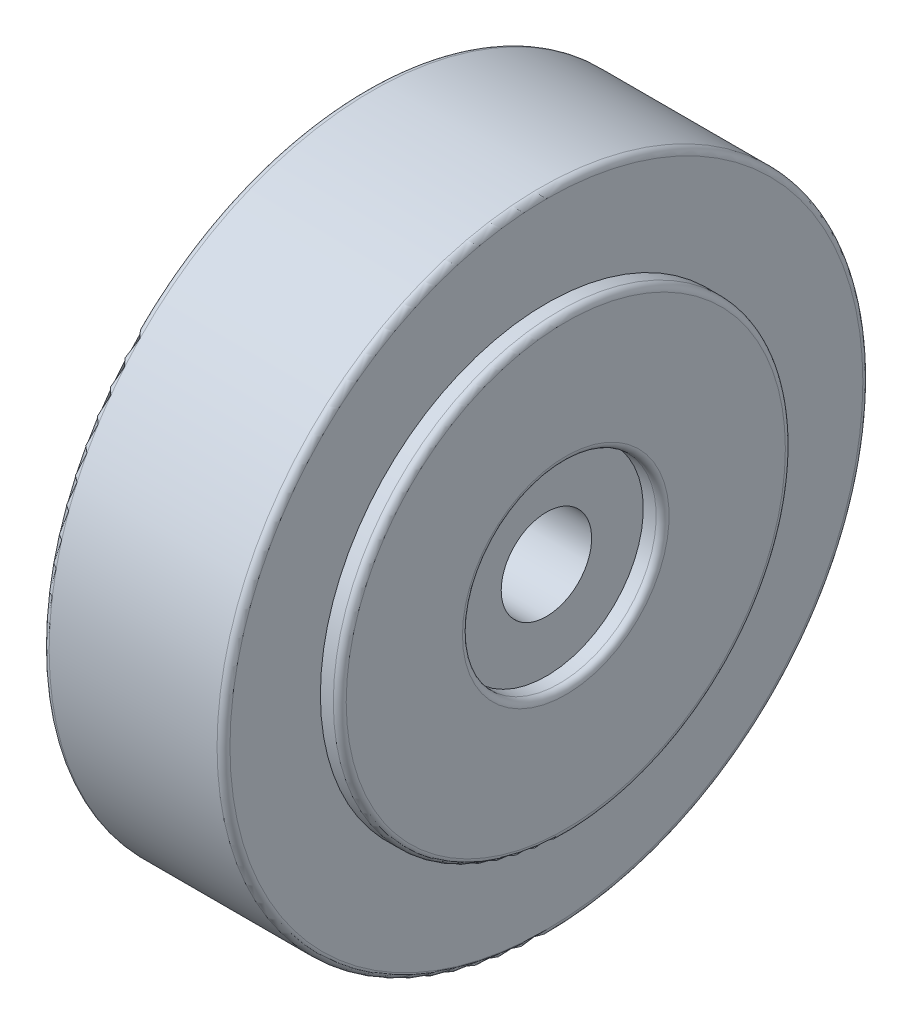
ISO-10303-21;
HEADER;
FILE_DESCRIPTION(('STEP AP214'),'2;1');
FILE_NAME('part.step','',(''),(''),'','','');
FILE_SCHEMA(('AUTOMOTIVE_DESIGN { 1 0 10303 214 1 1 1 1 }'));
ENDSEC;
DATA;
#1=APPLICATION_CONTEXT('core data for automotive mechanical design processes');
#2=APPLICATION_PROTOCOL_DEFINITION('international standard','automotive_design',2000,#1);
#3=PRODUCT_CONTEXT('',#1,'mechanical');
#4=PRODUCT('Part','Part','',(#3));
#5=PRODUCT_RELATED_PRODUCT_CATEGORY('part','',(#4));
#6=PRODUCT_DEFINITION_FORMATION('','',#4);
#7=PRODUCT_DEFINITION_CONTEXT('part definition',#1,'design');
#8=PRODUCT_DEFINITION('design','',#6,#7);
#9=PRODUCT_DEFINITION_SHAPE('','',#8);
#10=(LENGTH_UNIT() NAMED_UNIT(*) SI_UNIT(.MILLI.,.METRE.));
#11=(NAMED_UNIT(*) PLANE_ANGLE_UNIT() SI_UNIT($,.RADIAN.));
#12=(NAMED_UNIT(*) SI_UNIT($,.STERADIAN.) SOLID_ANGLE_UNIT());
#13=UNCERTAINTY_MEASURE_WITH_UNIT(LENGTH_MEASURE(1.E-05),#10,'distance_accuracy_value','');
#14=(GEOMETRIC_REPRESENTATION_CONTEXT(3) GLOBAL_UNCERTAINTY_ASSIGNED_CONTEXT((#13)) GLOBAL_UNIT_ASSIGNED_CONTEXT((#10,
#11,#12)) REPRESENTATION_CONTEXT('',''));
#15=CARTESIAN_POINT('',(0.,0.,0.));
#16=DIRECTION('',(0.,0.,1.));
#17=DIRECTION('',(1.,0.,0.));
#18=AXIS2_PLACEMENT_3D('',#15,#16,#17);
#19=CARTESIAN_POINT('',(0.,0.,0.));
#20=DIRECTION('',(-1.,0.,0.));
#21=DIRECTION('',(0.,0.,1.));
#22=AXIS2_PLACEMENT_3D('',#19,#20,#21);
#23=CYLINDRICAL_SURFACE('',#22,7.);
#24=CARTESIAN_POINT('',(14.,0.,0.));
#25=DIRECTION('',(-1.,0.,0.));
#26=DIRECTION('',(0.,0.,1.));
#27=AXIS2_PLACEMENT_3D('',#24,#25,#26);
#28=CIRCLE('',#27,7.);
#29=CARTESIAN_POINT('',(14.,0.,7.));
#30=VERTEX_POINT('',#29);
#31=EDGE_CURVE('E88',#30,#30,#28,.T.);
#32=ORIENTED_EDGE('',*,*,#31,.F.);
#33=EDGE_LOOP('',(#32));
#34=FACE_BOUND('',#33,.T.);
#35=CARTESIAN_POINT('',(-14.,0.,0.));
#36=DIRECTION('',(-1.,0.,0.));
#37=DIRECTION('',(0.,0.,1.));
#38=AXIS2_PLACEMENT_3D('',#35,#36,#37);
#39=CIRCLE('',#38,7.);
#40=CARTESIAN_POINT('',(-14.,0.,7.));
#41=VERTEX_POINT('',#40);
#42=EDGE_CURVE('E103',#41,#41,#39,.T.);
#43=ORIENTED_EDGE('',*,*,#42,.T.);
#44=EDGE_LOOP('',(#43));
#45=FACE_BOUND('',#44,.T.);
#46=ADVANCED_FACE('F44',(#34,#45),#23,.F.);
#47=CARTESIAN_POINT('',(14.,7.,0.));
#48=DIRECTION('',(-1.,0.,0.));
#49=DIRECTION('',(0.,0.,1.));
#50=AXIS2_PLACEMENT_3D('',#47,#48,#49);
#51=PLANE('',#50);
#52=CARTESIAN_POINT('',(14.,0.,0.));
#53=DIRECTION('',(-1.,0.,0.));
#54=DIRECTION('',(0.,0.,1.));
#55=AXIS2_PLACEMENT_3D('',#52,#53,#54);
#56=CIRCLE('',#55,15.);
#57=CARTESIAN_POINT('',(14.,0.,15.));
#58=VERTEX_POINT('',#57);
#59=EDGE_CURVE('E91',#58,#58,#56,.T.);
#60=ORIENTED_EDGE('',*,*,#59,.F.);
#61=EDGE_LOOP('',(#60));
#62=FACE_BOUND('',#61,.T.);
#63=ORIENTED_EDGE('',*,*,#31,.T.);
#64=EDGE_LOOP('',(#63));
#65=FACE_BOUND('',#64,.T.);
#66=ADVANCED_FACE('F128',(#62,#65),#51,.F.);
#67=CARTESIAN_POINT('',(0.,0.,0.));
#68=DIRECTION('',(-1.,0.,0.));
#69=DIRECTION('',(0.,0.,1.));
#70=AXIS2_PLACEMENT_3D('',#67,#68,#69);
#71=CYLINDRICAL_SURFACE('',#70,15.);
#72=CARTESIAN_POINT('',(16.,0.,0.));
#73=DIRECTION('',(-1.,0.,0.));
#74=DIRECTION('',(0.,0.,1.));
#75=AXIS2_PLACEMENT_3D('',#72,#73,#74);
#76=CIRCLE('',#75,15.);
#77=CARTESIAN_POINT('',(16.,0.,15.));
#78=VERTEX_POINT('',#77);
#79=EDGE_CURVE('E70',#78,#78,#76,.F.);
#80=ORIENTED_EDGE('',*,*,#79,.T.);
#81=EDGE_LOOP('',(#80));
#82=FACE_BOUND('',#81,.T.);
#83=ORIENTED_EDGE('',*,*,#59,.T.);
#84=EDGE_LOOP('',(#83));
#85=FACE_BOUND('',#84,.T.);
#86=ADVANCED_FACE('F134',(#82,#85),#71,.F.);
#87=CARTESIAN_POINT('',(17.,15.,0.));
#88=DIRECTION('',(-1.,0.,0.));
#89=DIRECTION('',(0.,0.,1.));
#90=AXIS2_PLACEMENT_3D('',#87,#88,#89);
#91=PLANE('',#90);
#92=CARTESIAN_POINT('',(17.,0.,0.));
#93=DIRECTION('',(-1.,0.,0.));
#94=DIRECTION('',(0.,0.,1.));
#95=AXIS2_PLACEMENT_3D('',#92,#93,#94);
#96=CIRCLE('',#95,16.);
#97=CARTESIAN_POINT('',(17.,0.,16.));
#98=VERTEX_POINT('',#97);
#99=EDGE_CURVE('E73',#98,#98,#96,.T.);
#100=ORIENTED_EDGE('',*,*,#99,.T.);
#101=EDGE_LOOP('',(#100));
#102=FACE_BOUND('',#101,.T.);
#103=CARTESIAN_POINT('',(17.,0.,0.));
#104=DIRECTION('',(-1.,0.,0.));
#105=DIRECTION('',(0.,0.,1.));
#106=AXIS2_PLACEMENT_3D('',#103,#104,#105);
#107=CIRCLE('',#106,34.);
#108=CARTESIAN_POINT('',(17.,0.,34.));
#109=VERTEX_POINT('',#108);
#110=EDGE_CURVE('E76',#109,#109,#107,.F.);
#111=ORIENTED_EDGE('',*,*,#110,.T.);
#112=EDGE_LOOP('',(#111));
#113=FACE_BOUND('',#112,.T.);
#114=ADVANCED_FACE('F185',(#102,#113),#91,.F.);
#115=CARTESIAN_POINT('',(0.,0.,0.));
#116=DIRECTION('',(-1.,0.,0.));
#117=DIRECTION('',(0.,0.,1.));
#118=AXIS2_PLACEMENT_3D('',#115,#116,#117);
#119=CYLINDRICAL_SURFACE('',#118,35.);
#120=CARTESIAN_POINT('',(16.,0.,0.));
#121=DIRECTION('',(-1.,0.,0.));
#122=DIRECTION('',(0.,0.,1.));
#123=AXIS2_PLACEMENT_3D('',#120,#121,#122);
#124=CIRCLE('',#123,35.);
#125=CARTESIAN_POINT('',(16.,0.,35.));
#126=VERTEX_POINT('',#125);
#127=EDGE_CURVE('E67',#126,#126,#124,.T.);
#128=ORIENTED_EDGE('',*,*,#127,.T.);
#129=EDGE_LOOP('',(#128));
#130=FACE_BOUND('',#129,.T.);
#131=CARTESIAN_POINT('',(14.,0.,0.));
#132=DIRECTION('',(-1.,0.,0.));
#133=DIRECTION('',(0.,0.,1.));
#134=AXIS2_PLACEMENT_3D('',#131,#132,#133);
#135=CIRCLE('',#134,35.);
#136=CARTESIAN_POINT('',(14.,0.,35.));
#137=VERTEX_POINT('',#136);
#138=EDGE_CURVE('E94',#137,#137,#135,.T.);
#139=ORIENTED_EDGE('',*,*,#138,.F.);
#140=EDGE_LOOP('',(#139));
#141=FACE_BOUND('',#140,.T.);
#142=ADVANCED_FACE('F182',(#130,#141),#119,.T.);
#143=CARTESIAN_POINT('',(14.,35.,0.));
#144=DIRECTION('',(-1.,0.,0.));
#145=DIRECTION('',(0.,0.,1.));
#146=AXIS2_PLACEMENT_3D('',#143,#144,#145);
#147=PLANE('',#146);
#148=CARTESIAN_POINT('',(14.,0.,0.));
#149=DIRECTION('',(-1.,0.,0.));
#150=DIRECTION('',(0.,0.,1.));
#151=AXIS2_PLACEMENT_3D('',#148,#149,#150);
#152=CIRCLE('',#151,49.);
#153=CARTESIAN_POINT('',(14.,0.,49.));
#154=VERTEX_POINT('',#153);
#155=EDGE_CURVE('E10',#154,#154,#152,.F.);
#156=ORIENTED_EDGE('',*,*,#155,.T.);
#157=EDGE_LOOP('',(#156));
#158=FACE_BOUND('',#157,.T.);
#159=ORIENTED_EDGE('',*,*,#138,.T.);
#160=EDGE_LOOP('',(#159));
#161=FACE_BOUND('',#160,.T.);
#162=ADVANCED_FACE('F179',(#158,#161),#147,.F.);
#163=CARTESIAN_POINT('',(0.,0.,0.));
#164=DIRECTION('',(-1.,0.,0.));
#165=DIRECTION('',(0.,0.,1.));
#166=AXIS2_PLACEMENT_3D('',#163,#164,#165);
#167=CYLINDRICAL_SURFACE('',#166,50.);
#168=CARTESIAN_POINT('',(-13.,0.,0.));
#169=DIRECTION('',(1.,0.,0.));
#170=DIRECTION('',(0.,0.,-1.));
#171=AXIS2_PLACEMENT_3D('',#168,#169,#170);
#172=CIRCLE('',#171,50.);
#173=CARTESIAN_POINT('',(-13.,0.,-50.));
#174=VERTEX_POINT('',#173);
#175=EDGE_CURVE('E51',#174,#174,#172,.T.);
#176=ORIENTED_EDGE('',*,*,#175,.T.);
#177=EDGE_LOOP('',(#176));
#178=FACE_BOUND('',#177,.T.);
#179=CARTESIAN_POINT('',(13.,0.,0.));
#180=DIRECTION('',(-1.,0.,0.));
#181=DIRECTION('',(0.,0.,1.));
#182=AXIS2_PLACEMENT_3D('',#179,#180,#181);
#183=CIRCLE('',#182,50.);
#184=CARTESIAN_POINT('',(13.,0.,50.));
#185=VERTEX_POINT('',#184);
#186=EDGE_CURVE('E55',#185,#185,#183,.T.);
#187=ORIENTED_EDGE('',*,*,#186,.T.);
#188=EDGE_LOOP('',(#187));
#189=FACE_BOUND('',#188,.T.);
#190=ADVANCED_FACE('F166',(#178,#189),#167,.T.);
#191=CARTESIAN_POINT('',(-14.,35.,0.));
#192=DIRECTION('',(1.,0.,0.));
#193=DIRECTION('',(0.,0.,-1.));
#194=AXIS2_PLACEMENT_3D('',#191,#192,#193);
#195=PLANE('',#194);
#196=CARTESIAN_POINT('',(-14.,0.,0.));
#197=DIRECTION('',(1.,0.,0.));
#198=DIRECTION('',(0.,0.,-1.));
#199=AXIS2_PLACEMENT_3D('',#196,#197,#198);
#200=CIRCLE('',#199,49.);
#201=CARTESIAN_POINT('',(-14.,0.,-49.));
#202=VERTEX_POINT('',#201);
#203=EDGE_CURVE('E59',#202,#202,#200,.F.);
#204=ORIENTED_EDGE('',*,*,#203,.T.);
#205=EDGE_LOOP('',(#204));
#206=FACE_BOUND('',#205,.T.);
#207=CARTESIAN_POINT('',(-14.,0.,0.));
#208=DIRECTION('',(-1.,0.,0.));
#209=DIRECTION('',(0.,0.,1.));
#210=AXIS2_PLACEMENT_3D('',#207,#208,#209);
#211=CIRCLE('',#210,35.);
#212=CARTESIAN_POINT('',(-14.,0.,35.));
#213=VERTEX_POINT('',#212);
#214=EDGE_CURVE('E97',#213,#213,#211,.T.);
#215=ORIENTED_EDGE('',*,*,#214,.F.);
#216=EDGE_LOOP('',(#215));
#217=FACE_BOUND('',#216,.T.);
#218=ADVANCED_FACE('F164',(#206,#217),#195,.F.);
#219=CARTESIAN_POINT('',(0.,0.,0.));
#220=DIRECTION('',(-1.,0.,0.));
#221=DIRECTION('',(0.,0.,1.));
#222=AXIS2_PLACEMENT_3D('',#219,#220,#221);
#223=CYLINDRICAL_SURFACE('',#222,35.);
#224=CARTESIAN_POINT('',(-16.,0.,0.));
#225=DIRECTION('',(1.,0.,0.));
#226=DIRECTION('',(0.,0.,-1.));
#227=AXIS2_PLACEMENT_3D('',#224,#225,#226);
#228=CIRCLE('',#227,35.);
#229=CARTESIAN_POINT('',(-16.,0.,-35.));
#230=VERTEX_POINT('',#229);
#231=EDGE_CURVE('E64',#230,#230,#228,.T.);
#232=ORIENTED_EDGE('',*,*,#231,.T.);
#233=EDGE_LOOP('',(#232));
#234=FACE_BOUND('',#233,.T.);
#235=ORIENTED_EDGE('',*,*,#214,.T.);
#236=EDGE_LOOP('',(#235));
#237=FACE_BOUND('',#236,.T.);
#238=ADVANCED_FACE('F124',(#234,#237),#223,.T.);
#239=CARTESIAN_POINT('',(-17.,15.,0.));
#240=DIRECTION('',(1.,0.,0.));
#241=DIRECTION('',(0.,0.,-1.));
#242=AXIS2_PLACEMENT_3D('',#239,#240,#241);
#243=PLANE('',#242);
#244=CARTESIAN_POINT('',(-17.,0.,0.));
#245=DIRECTION('',(1.,0.,0.));
#246=DIRECTION('',(0.,0.,-1.));
#247=AXIS2_PLACEMENT_3D('',#244,#245,#246);
#248=CIRCLE('',#247,16.);
#249=CARTESIAN_POINT('',(-17.,0.,-16.));
#250=VERTEX_POINT('',#249);
#251=EDGE_CURVE('E79',#250,#250,#248,.T.);
#252=ORIENTED_EDGE('',*,*,#251,.T.);
#253=EDGE_LOOP('',(#252));
#254=FACE_BOUND('',#253,.T.);
#255=CARTESIAN_POINT('',(-17.,0.,0.));
#256=DIRECTION('',(1.,0.,0.));
#257=DIRECTION('',(0.,0.,-1.));
#258=AXIS2_PLACEMENT_3D('',#255,#256,#257);
#259=CIRCLE('',#258,34.);
#260=CARTESIAN_POINT('',(-17.,0.,-34.));
#261=VERTEX_POINT('',#260);
#262=EDGE_CURVE('E82',#261,#261,#259,.F.);
#263=ORIENTED_EDGE('',*,*,#262,.T.);
#264=EDGE_LOOP('',(#263));
#265=FACE_BOUND('',#264,.T.);
#266=ADVANCED_FACE('F117',(#254,#265),#243,.F.);
#267=CARTESIAN_POINT('',(0.,0.,0.));
#268=DIRECTION('',(-1.,0.,0.));
#269=DIRECTION('',(0.,0.,1.));
#270=AXIS2_PLACEMENT_3D('',#267,#268,#269);
#271=CYLINDRICAL_SURFACE('',#270,15.);
#272=CARTESIAN_POINT('',(-16.,0.,0.));
#273=DIRECTION('',(1.,0.,0.));
#274=DIRECTION('',(0.,0.,-1.));
#275=AXIS2_PLACEMENT_3D('',#272,#273,#274);
#276=CIRCLE('',#275,15.);
#277=CARTESIAN_POINT('',(-16.,0.,-15.));
#278=VERTEX_POINT('',#277);
#279=EDGE_CURVE('E85',#278,#278,#276,.F.);
#280=ORIENTED_EDGE('',*,*,#279,.T.);
#281=EDGE_LOOP('',(#280));
#282=FACE_BOUND('',#281,.T.);
#283=CARTESIAN_POINT('',(-14.,0.,0.));
#284=DIRECTION('',(-1.,0.,0.));
#285=DIRECTION('',(0.,0.,1.));
#286=AXIS2_PLACEMENT_3D('',#283,#284,#285);
#287=CIRCLE('',#286,15.);
#288=CARTESIAN_POINT('',(-14.,0.,15.));
#289=VERTEX_POINT('',#288);
#290=EDGE_CURVE('E100',#289,#289,#287,.T.);
#291=ORIENTED_EDGE('',*,*,#290,.F.);
#292=EDGE_LOOP('',(#291));
#293=FACE_BOUND('',#292,.T.);
#294=ADVANCED_FACE('F112',(#282,#293),#271,.F.);
#295=CARTESIAN_POINT('',(-14.,7.,0.));
#296=DIRECTION('',(1.,0.,0.));
#297=DIRECTION('',(0.,0.,-1.));
#298=AXIS2_PLACEMENT_3D('',#295,#296,#297);
#299=PLANE('',#298);
#300=ORIENTED_EDGE('',*,*,#42,.F.);
#301=EDGE_LOOP('',(#300));
#302=FACE_BOUND('',#301,.T.);
#303=ORIENTED_EDGE('',*,*,#290,.T.);
#304=EDGE_LOOP('',(#303));
#305=FACE_BOUND('',#304,.T.);
#306=ADVANCED_FACE('F108',(#302,#305),#299,.F.);
#307=CARTESIAN_POINT('',(-16.,0.,0.));
#308=DIRECTION('',(1.,0.,0.));
#309=DIRECTION('',(0.,0.,-1.));
#310=AXIS2_PLACEMENT_3D('',#307,#308,#309);
#311=TOROIDAL_SURFACE('',#310,16.,1.);
#312=ORIENTED_EDGE('',*,*,#251,.F.);
#313=EDGE_LOOP('',(#312));
#314=FACE_BOUND('',#313,.T.);
#315=ORIENTED_EDGE('',*,*,#279,.F.);
#316=EDGE_LOOP('',(#315));
#317=FACE_BOUND('',#316,.T.);
#318=ADVANCED_FACE('F111',(#314,#317),#311,.T.);
#319=CARTESIAN_POINT('',(16.,0.,0.));
#320=DIRECTION('',(-1.,0.,0.));
#321=DIRECTION('',(0.,0.,1.));
#322=AXIS2_PLACEMENT_3D('',#319,#320,#321);
#323=TOROIDAL_SURFACE('',#322,16.,1.);
#324=ORIENTED_EDGE('',*,*,#79,.F.);
#325=EDGE_LOOP('',(#324));
#326=FACE_BOUND('',#325,.T.);
#327=ORIENTED_EDGE('',*,*,#99,.F.);
#328=EDGE_LOOP('',(#327));
#329=FACE_BOUND('',#328,.T.);
#330=ADVANCED_FACE('F141',(#326,#329),#323,.T.);
#331=CARTESIAN_POINT('',(16.,0.,0.));
#332=DIRECTION('',(-1.,0.,0.));
#333=DIRECTION('',(0.,0.,1.));
#334=AXIS2_PLACEMENT_3D('',#331,#332,#333);
#335=TOROIDAL_SURFACE('',#334,34.,1.);
#336=ORIENTED_EDGE('',*,*,#110,.F.);
#337=EDGE_LOOP('',(#336));
#338=FACE_BOUND('',#337,.T.);
#339=ORIENTED_EDGE('',*,*,#127,.F.);
#340=EDGE_LOOP('',(#339));
#341=FACE_BOUND('',#340,.T.);
#342=ADVANCED_FACE('F145',(#338,#341),#335,.T.);
#343=CARTESIAN_POINT('',(-16.,0.,0.));
#344=DIRECTION('',(1.,0.,0.));
#345=DIRECTION('',(0.,0.,-1.));
#346=AXIS2_PLACEMENT_3D('',#343,#344,#345);
#347=TOROIDAL_SURFACE('',#346,34.,1.);
#348=ORIENTED_EDGE('',*,*,#231,.F.);
#349=EDGE_LOOP('',(#348));
#350=FACE_BOUND('',#349,.T.);
#351=ORIENTED_EDGE('',*,*,#262,.F.);
#352=EDGE_LOOP('',(#351));
#353=FACE_BOUND('',#352,.T.);
#354=ADVANCED_FACE('F149',(#350,#353),#347,.T.);
#355=CARTESIAN_POINT('',(-13.,0.,0.));
#356=DIRECTION('',(1.,0.,0.));
#357=DIRECTION('',(0.,0.,-1.));
#358=AXIS2_PLACEMENT_3D('',#355,#356,#357);
#359=TOROIDAL_SURFACE('',#358,49.,1.);
#360=ORIENTED_EDGE('',*,*,#175,.F.);
#361=EDGE_LOOP('',(#360));
#362=FACE_BOUND('',#361,.T.);
#363=ORIENTED_EDGE('',*,*,#203,.F.);
#364=EDGE_LOOP('',(#363));
#365=FACE_BOUND('',#364,.T.);
#366=ADVANCED_FACE('F152',(#362,#365),#359,.T.);
#367=CARTESIAN_POINT('',(13.,0.,0.));
#368=DIRECTION('',(-1.,0.,0.));
#369=DIRECTION('',(0.,0.,1.));
#370=AXIS2_PLACEMENT_3D('',#367,#368,#369);
#371=TOROIDAL_SURFACE('',#370,49.,1.);
#372=ORIENTED_EDGE('',*,*,#155,.F.);
#373=EDGE_LOOP('',(#372));
#374=FACE_BOUND('',#373,.T.);
#375=ORIENTED_EDGE('',*,*,#186,.F.);
#376=EDGE_LOOP('',(#375));
#377=FACE_BOUND('',#376,.T.);
#378=ADVANCED_FACE('F46',(#374,#377),#371,.T.);
#379=CLOSED_SHELL('',(#46,#66,#86,#114,#142,#162,#190,#218,#238,#266,#294,#306,#318,#330,#342,
#354,#366,#378));
#380=MANIFOLD_SOLID_BREP('B2',#379);
#381=ADVANCED_BREP_SHAPE_REPRESENTATION('',(#18,#380),#14);
#382=SHAPE_DEFINITION_REPRESENTATION(#9,#381);
ENDSEC;
END-ISO-10303-21;
